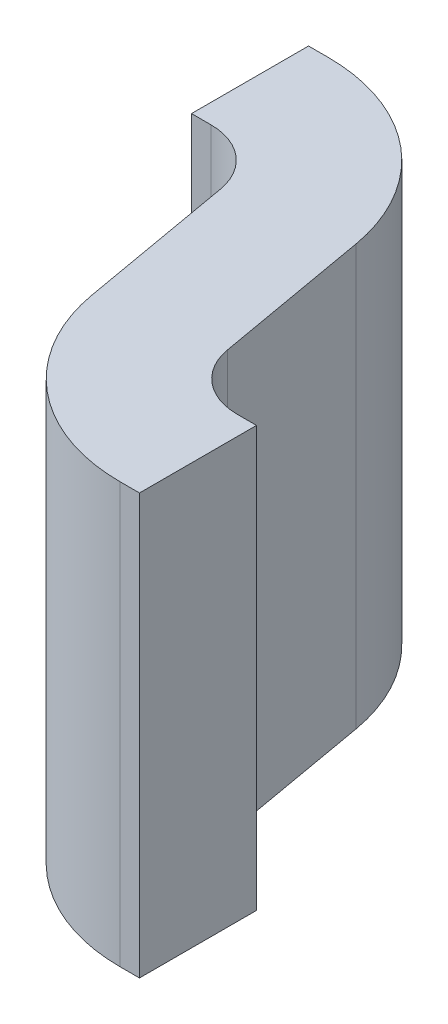
ISO-10303-21;
HEADER;
FILE_DESCRIPTION(('STEP AP214'),'2;1');
FILE_NAME('part.step','',(''),(''),'','','');
FILE_SCHEMA(('AUTOMOTIVE_DESIGN { 1 0 10303 214 1 1 1 1 }'));
ENDSEC;
DATA;
#1=APPLICATION_CONTEXT('core data for automotive mechanical design processes');
#2=APPLICATION_PROTOCOL_DEFINITION('international standard','automotive_design',2000,#1);
#3=PRODUCT_CONTEXT('',#1,'mechanical');
#4=PRODUCT('Part','Part','',(#3));
#5=PRODUCT_RELATED_PRODUCT_CATEGORY('part','',(#4));
#6=PRODUCT_DEFINITION_FORMATION('','',#4);
#7=PRODUCT_DEFINITION_CONTEXT('part definition',#1,'design');
#8=PRODUCT_DEFINITION('design','',#6,#7);
#9=PRODUCT_DEFINITION_SHAPE('','',#8);
#10=(LENGTH_UNIT() NAMED_UNIT(*) SI_UNIT(.MILLI.,.METRE.));
#11=(NAMED_UNIT(*) PLANE_ANGLE_UNIT() SI_UNIT($,.RADIAN.));
#12=(NAMED_UNIT(*) SI_UNIT($,.STERADIAN.) SOLID_ANGLE_UNIT());
#13=UNCERTAINTY_MEASURE_WITH_UNIT(LENGTH_MEASURE(1.E-05),#10,'distance_accuracy_value','');
#14=(GEOMETRIC_REPRESENTATION_CONTEXT(3) GLOBAL_UNCERTAINTY_ASSIGNED_CONTEXT((#13)) GLOBAL_UNIT_ASSIGNED_CONTEXT((#10,
#11,#12)) REPRESENTATION_CONTEXT('',''));
#15=CARTESIAN_POINT('',(0.,0.,0.));
#16=DIRECTION('',(0.,0.,1.));
#17=DIRECTION('',(1.,0.,0.));
#18=AXIS2_PLACEMENT_3D('',#15,#16,#17);
#19=CARTESIAN_POINT('',(0.,-0.35,-0.0975));
#20=DIRECTION('',(0.,0.,-1.));
#21=DIRECTION('',(-1.,0.,0.));
#22=AXIS2_PLACEMENT_3D('',#19,#20,#21);
#23=PLANE('',#22);
#24=DIRECTION('',(0.,1.,0.));
#25=VECTOR('',#24,1.);
#26=CARTESIAN_POINT('',(0.,0.,-0.0975));
#27=LINE('',#26,#25);
#28=CARTESIAN_POINT('',(0.,-0.35,-0.0975));
#29=VERTEX_POINT('',#28);
#30=CARTESIAN_POINT('',(0.,0.35,-0.0975));
#31=VERTEX_POINT('',#30);
#32=EDGE_CURVE('E98',#29,#31,#27,.T.);
#33=ORIENTED_EDGE('',*,*,#32,.F.);
#34=DIRECTION('',(1.,0.,0.));
#35=VECTOR('',#34,1.);
#36=CARTESIAN_POINT('',(0.,-0.35,-0.0975));
#37=LINE('',#36,#35);
#38=CARTESIAN_POINT('',(-0.03218007376454,-0.35,-0.0975));
#39=VERTEX_POINT('',#38);
#40=EDGE_CURVE('E164',#39,#29,#37,.T.);
#41=ORIENTED_EDGE('',*,*,#40,.F.);
#42=DIRECTION('',(0.,-1.,0.));
#43=VECTOR('',#42,1.);
#44=CARTESIAN_POINT('',(-0.03218007376454,0.,-0.0975));
#45=LINE('',#44,#43);
#46=CARTESIAN_POINT('',(-0.03218007376454,0.35,-0.0975));
#47=VERTEX_POINT('',#46);
#48=EDGE_CURVE('E89',#39,#47,#45,.F.);
#49=ORIENTED_EDGE('',*,*,#48,.T.);
#50=DIRECTION('',(1.,0.,0.));
#51=VECTOR('',#50,1.);
#52=CARTESIAN_POINT('',(0.,0.35,-0.0975));
#53=LINE('',#52,#51);
#54=EDGE_CURVE('E178',#31,#47,#53,.F.);
#55=ORIENTED_EDGE('',*,*,#54,.F.);
#56=EDGE_LOOP('',(#33,#41,#49,#55));
#57=FACE_BOUND('',#56,.T.);
#58=ADVANCED_FACE('F17',(#57),#23,.T.);
#59=CARTESIAN_POINT('',(0.,0.,0.));
#60=DIRECTION('',(1.,0.,0.));
#61=DIRECTION('',(0.,0.,-1.));
#62=AXIS2_PLACEMENT_3D('',#59,#60,#61);
#63=PLANE('',#62);
#64=ORIENTED_EDGE('',*,*,#32,.T.);
#65=DIRECTION('',(0.,0.,1.));
#66=VECTOR('',#65,1.);
#67=CARTESIAN_POINT('',(0.,0.35,-0.0975));
#68=LINE('',#67,#66);
#69=CARTESIAN_POINT('',(0.,0.35,0.0975));
#70=VERTEX_POINT('',#69);
#71=EDGE_CURVE('E175',#70,#31,#68,.F.);
#72=ORIENTED_EDGE('',*,*,#71,.F.);
#73=DIRECTION('',(0.,1.,0.));
#74=VECTOR('',#73,1.);
#75=CARTESIAN_POINT('',(0.,0.35,0.0975));
#76=LINE('',#75,#74);
#77=CARTESIAN_POINT('',(0.,-0.35,0.0975));
#78=VERTEX_POINT('',#77);
#79=EDGE_CURVE('E156',#78,#70,#76,.T.);
#80=ORIENTED_EDGE('',*,*,#79,.F.);
#81=DIRECTION('',(0.,0.,-1.));
#82=VECTOR('',#81,1.);
#83=CARTESIAN_POINT('',(0.,-0.35,0.0975));
#84=LINE('',#83,#82);
#85=EDGE_CURVE('E160',#29,#78,#84,.F.);
#86=ORIENTED_EDGE('',*,*,#85,.F.);
#87=EDGE_LOOP('',(#64,#72,#80,#86));
#88=FACE_BOUND('',#87,.T.);
#89=ADVANCED_FACE('F366',(#88),#63,.T.);
#90=CARTESIAN_POINT('',(0.,0.35,0.0975));
#91=DIRECTION('',(0.,0.,1.));
#92=DIRECTION('',(1.,0.,0.));
#93=AXIS2_PLACEMENT_3D('',#90,#91,#92);
#94=PLANE('',#93);
#95=ORIENTED_EDGE('',*,*,#79,.T.);
#96=DIRECTION('',(1.,0.,0.));
#97=VECTOR('',#96,1.);
#98=CARTESIAN_POINT('',(0.,0.35,0.0975));
#99=LINE('',#98,#97);
#100=CARTESIAN_POINT('',(-0.03218007376454,0.35,0.0975));
#101=VERTEX_POINT('',#100);
#102=EDGE_CURVE('E122',#101,#70,#99,.T.);
#103=ORIENTED_EDGE('',*,*,#102,.F.);
#104=DIRECTION('',(0.,-1.,0.));
#105=VECTOR('',#104,1.);
#106=CARTESIAN_POINT('',(-0.03218007376454,0.,0.0975));
#107=LINE('',#106,#105);
#108=CARTESIAN_POINT('',(-0.03218007376454,-0.35,0.0975));
#109=VERTEX_POINT('',#108);
#110=EDGE_CURVE('E153',#109,#101,#107,.F.);
#111=ORIENTED_EDGE('',*,*,#110,.F.);
#112=DIRECTION('',(1.,0.,0.));
#113=VECTOR('',#112,1.);
#114=CARTESIAN_POINT('',(0.,-0.35,0.0975));
#115=LINE('',#114,#113);
#116=EDGE_CURVE('E163',#78,#109,#115,.F.);
#117=ORIENTED_EDGE('',*,*,#116,.F.);
#118=EDGE_LOOP('',(#95,#103,#111,#117));
#119=FACE_BOUND('',#118,.T.);
#120=ADVANCED_FACE('F355',(#119),#94,.T.);
#121=CARTESIAN_POINT('',(-0.03218007376454,0.,-0.2));
#122=DIRECTION('',(0.,-1.,0.));
#123=DIRECTION('',(0.,0.,-1.));
#124=AXIS2_PLACEMENT_3D('',#121,#122,#123);
#125=CYLINDRICAL_SURFACE('',#124,0.2975);
#126=ORIENTED_EDGE('',*,*,#110,.T.);
#127=CARTESIAN_POINT('',(-0.03218007376454,0.35,-0.2));
#128=DIRECTION('',(0.,-1.,0.));
#129=DIRECTION('',(0.,0.,-1.));
#130=AXIS2_PLACEMENT_3D('',#127,#128,#129);
#131=CIRCLE('',#130,0.2975);
#132=CARTESIAN_POINT('',(-0.325160380286019,0.35,-0.148339667144107));
#133=VERTEX_POINT('',#132);
#134=EDGE_CURVE('E192',#133,#101,#131,.F.);
#135=ORIENTED_EDGE('',*,*,#134,.F.);
#136=DIRECTION('',(0.,1.,0.));
#137=VECTOR('',#136,1.);
#138=CARTESIAN_POINT('',(-0.325160380286,0.35,-0.148339667144));
#139=LINE('',#138,#137);
#140=CARTESIAN_POINT('',(-0.325160380286019,-0.35,-0.148339667144107));
#141=VERTEX_POINT('',#140);
#142=EDGE_CURVE('E151',#141,#133,#139,.T.);
#143=ORIENTED_EDGE('',*,*,#142,.F.);
#144=CARTESIAN_POINT('',(-0.03218007376454,-0.35,-0.2));
#145=DIRECTION('',(0.,-1.,0.));
#146=DIRECTION('',(0.,0.,-1.));
#147=AXIS2_PLACEMENT_3D('',#144,#145,#146);
#148=CIRCLE('',#147,0.2975);
#149=EDGE_CURVE('E189',#109,#141,#148,.T.);
#150=ORIENTED_EDGE('',*,*,#149,.F.);
#151=EDGE_LOOP('',(#126,#135,#143,#150));
#152=FACE_BOUND('',#151,.T.);
#153=ADVANCED_FACE('F344',(#152),#125,.T.);
#154=CARTESIAN_POINT('',(-0.325160380286,0.35,-0.148339667144));
#155=DIRECTION('',(-0.98480775301219,0.,0.173648177667033));
#156=DIRECTION('',(0.173648177667033,0.,0.98480775301219));
#157=AXIS2_PLACEMENT_3D('',#154,#155,#156);
#158=PLANE('',#157);
#159=ORIENTED_EDGE('',*,*,#142,.T.);
#160=DIRECTION('',(0.173648177666307,0.,0.984807753012318));
#161=VECTOR('',#160,1.);
#162=CARTESIAN_POINT('',(-0.371066038152,0.35,-0.408683590018));
#163=LINE('',#162,#161);
#164=CARTESIAN_POINT('',(-0.371066038152119,0.35,-0.408683590017898));
#165=VERTEX_POINT('',#164);
#166=EDGE_CURVE('E195',#165,#133,#163,.T.);
#167=ORIENTED_EDGE('',*,*,#166,.F.);
#168=DIRECTION('',(0.,1.,0.));
#169=VECTOR('',#168,1.);
#170=CARTESIAN_POINT('',(-0.371066038152265,0.,-0.408683590017953));
#171=LINE('',#170,#169);
#172=CARTESIAN_POINT('',(-0.371066038152119,-0.35,-0.408683590017898));
#173=VERTEX_POINT('',#172);
#174=EDGE_CURVE('E149',#165,#173,#171,.F.);
#175=ORIENTED_EDGE('',*,*,#174,.T.);
#176=DIRECTION('',(-0.173648177666307,0.,-0.984807753012318));
#177=VECTOR('',#176,1.);
#178=CARTESIAN_POINT('',(-0.325160380286,-0.35,-0.148339667144));
#179=LINE('',#178,#177);
#180=EDGE_CURVE('E188',#141,#173,#179,.T.);
#181=ORIENTED_EDGE('',*,*,#180,.F.);
#182=EDGE_LOOP('',(#159,#167,#175,#181));
#183=FACE_BOUND('',#182,.T.);
#184=ADVANCED_FACE('F333',(#183),#158,.T.);
#185=CARTESIAN_POINT('',(-0.472008832836,0.,-0.390884651807));
#186=DIRECTION('',(0.,1.,0.));
#187=DIRECTION('',(0.,0.,1.));
#188=AXIS2_PLACEMENT_3D('',#185,#186,#187);
#189=CYLINDRICAL_SURFACE('',#188,0.1025);
#190=CARTESIAN_POINT('',(-0.472008832836,-0.35,-0.390884651807));
#191=DIRECTION('',(0.,1.,0.));
#192=DIRECTION('',(0.,0.,1.));
#193=AXIS2_PLACEMENT_3D('',#190,#191,#192);
#194=CIRCLE('',#193,0.1025);
#195=CARTESIAN_POINT('',(-0.472008832836,-0.35,-0.493384651807));
#196=VERTEX_POINT('',#195);
#197=EDGE_CURVE('E136',#173,#196,#194,.T.);
#198=ORIENTED_EDGE('',*,*,#197,.F.);
#199=ORIENTED_EDGE('',*,*,#174,.F.);
#200=CARTESIAN_POINT('',(-0.472008832836,0.35,-0.390884651807));
#201=DIRECTION('',(0.,1.,0.));
#202=DIRECTION('',(0.,0.,1.));
#203=AXIS2_PLACEMENT_3D('',#200,#201,#202);
#204=CIRCLE('',#203,0.1025);
#205=CARTESIAN_POINT('',(-0.472008832836,0.35,-0.493384651807));
#206=VERTEX_POINT('',#205);
#207=EDGE_CURVE('E196',#206,#165,#204,.F.);
#208=ORIENTED_EDGE('',*,*,#207,.F.);
#209=DIRECTION('',(0.,1.,0.));
#210=VECTOR('',#209,1.);
#211=CARTESIAN_POINT('',(-0.472008832836,0.35,-0.493384651807));
#212=LINE('',#211,#210);
#213=EDGE_CURVE('E145',#196,#206,#212,.T.);
#214=ORIENTED_EDGE('',*,*,#213,.F.);
#215=EDGE_LOOP('',(#198,#199,#208,#214));
#216=FACE_BOUND('',#215,.T.);
#217=ADVANCED_FACE('F322',(#216),#189,.F.);
#218=CARTESIAN_POINT('',(-0.472008832836,0.35,-0.493384651807));
#219=DIRECTION('',(0.,0.,1.));
#220=DIRECTION('',(1.,0.,0.));
#221=AXIS2_PLACEMENT_3D('',#218,#219,#220);
#222=PLANE('',#221);
#223=ORIENTED_EDGE('',*,*,#213,.T.);
#224=DIRECTION('',(1.,0.,0.));
#225=VECTOR('',#224,1.);
#226=CARTESIAN_POINT('',(0.,0.35,-0.493384651807));
#227=LINE('',#226,#225);
#228=CARTESIAN_POINT('',(-0.5041889066,0.35,-0.493384651807));
#229=VERTEX_POINT('',#228);
#230=EDGE_CURVE('E171',#229,#206,#227,.T.);
#231=ORIENTED_EDGE('',*,*,#230,.F.);
#232=DIRECTION('',(0.,1.,0.));
#233=VECTOR('',#232,1.);
#234=CARTESIAN_POINT('',(-0.5041889066,0.,-0.493384651807));
#235=LINE('',#234,#233);
#236=CARTESIAN_POINT('',(-0.5041889066,-0.35,-0.493384651807));
#237=VERTEX_POINT('',#236);
#238=EDGE_CURVE('E143',#229,#237,#235,.F.);
#239=ORIENTED_EDGE('',*,*,#238,.T.);
#240=DIRECTION('',(1.,0.,0.));
#241=VECTOR('',#240,1.);
#242=CARTESIAN_POINT('',(0.,-0.35,-0.493384651807));
#243=LINE('',#242,#241);
#244=EDGE_CURVE('E134',#196,#237,#243,.F.);
#245=ORIENTED_EDGE('',*,*,#244,.F.);
#246=EDGE_LOOP('',(#223,#231,#239,#245));
#247=FACE_BOUND('',#246,.T.);
#248=ADVANCED_FACE('F312',(#247),#222,.T.);
#249=CARTESIAN_POINT('',(-0.5041889066,0.,-0.590884651807));
#250=DIRECTION('',(1.,0.,0.));
#251=DIRECTION('',(0.,0.,-1.));
#252=AXIS2_PLACEMENT_3D('',#249,#250,#251);
#253=PLANE('',#252);
#254=ORIENTED_EDGE('',*,*,#238,.F.);
#255=DIRECTION('',(0.,0.,1.));
#256=VECTOR('',#255,1.);
#257=CARTESIAN_POINT('',(-0.5041889066,0.35,-0.0975));
#258=LINE('',#257,#256);
#259=CARTESIAN_POINT('',(-0.5041889066,0.35,-0.688384651807));
#260=VERTEX_POINT('',#259);
#261=EDGE_CURVE('E119',#260,#229,#258,.T.);
#262=ORIENTED_EDGE('',*,*,#261,.F.);
#263=DIRECTION('',(0.,1.,0.));
#264=VECTOR('',#263,1.);
#265=CARTESIAN_POINT('',(-0.5041889066,-0.35,-0.688384651807));
#266=LINE('',#265,#264);
#267=CARTESIAN_POINT('',(-0.5041889066,-0.35,-0.688384651807));
#268=VERTEX_POINT('',#267);
#269=EDGE_CURVE('E112',#268,#260,#266,.T.);
#270=ORIENTED_EDGE('',*,*,#269,.F.);
#271=DIRECTION('',(0.,0.,-1.));
#272=VECTOR('',#271,1.);
#273=CARTESIAN_POINT('',(-0.5041889066,-0.35,0.0975));
#274=LINE('',#273,#272);
#275=EDGE_CURVE('E116',#237,#268,#274,.T.);
#276=ORIENTED_EDGE('',*,*,#275,.F.);
#277=EDGE_LOOP('',(#254,#262,#270,#276));
#278=FACE_BOUND('',#277,.T.);
#279=ADVANCED_FACE('F114',(#278),#253,.F.);
#280=CARTESIAN_POINT('',(-0.03218007376454,0.,-0.2));
#281=DIRECTION('',(0.,-1.,0.));
#282=DIRECTION('',(0.,0.,-1.));
#283=AXIS2_PLACEMENT_3D('',#280,#281,#282);
#284=CYLINDRICAL_SURFACE('',#283,0.1025);
#285=CARTESIAN_POINT('',(-0.03218007376454,0.35,-0.2));
#286=DIRECTION('',(0.,-1.,0.));
#287=DIRECTION('',(0.,0.,-1.));
#288=AXIS2_PLACEMENT_3D('',#285,#286,#287);
#289=CIRCLE('',#288,0.1025);
#290=CARTESIAN_POINT('',(-0.133122868448015,0.35,-0.182201061789087));
#291=VERTEX_POINT('',#290);
#292=EDGE_CURVE('E20',#47,#291,#289,.T.);
#293=ORIENTED_EDGE('',*,*,#292,.F.);
#294=ORIENTED_EDGE('',*,*,#48,.F.);
#295=CARTESIAN_POINT('',(-0.03218007376454,-0.35,-0.2));
#296=DIRECTION('',(0.,-1.,0.));
#297=DIRECTION('',(0.,0.,-1.));
#298=AXIS2_PLACEMENT_3D('',#295,#296,#297);
#299=CIRCLE('',#298,0.1025);
#300=CARTESIAN_POINT('',(-0.133122868448022,-0.35,-0.182201061789125));
#301=VERTEX_POINT('',#300);
#302=EDGE_CURVE('E184',#301,#39,#299,.F.);
#303=ORIENTED_EDGE('',*,*,#302,.F.);
#304=DIRECTION('',(0.,1.,0.));
#305=VECTOR('',#304,1.);
#306=CARTESIAN_POINT('',(-0.133122868448,-0.35,-0.182201061789));
#307=LINE('',#306,#305);
#308=EDGE_CURVE('E221',#291,#301,#307,.F.);
#309=ORIENTED_EDGE('',*,*,#308,.F.);
#310=EDGE_LOOP('',(#293,#294,#303,#309));
#311=FACE_BOUND('',#310,.T.);
#312=ADVANCED_FACE('F292',(#311),#284,.F.);
#313=CARTESIAN_POINT('',(-0.472008832836,-0.35,-0.688384651807));
#314=DIRECTION('',(0.,0.,-1.));
#315=DIRECTION('',(-1.,0.,0.));
#316=AXIS2_PLACEMENT_3D('',#313,#314,#315);
#317=PLANE('',#316);
#318=DIRECTION('',(0.,1.,0.));
#319=VECTOR('',#318,1.);
#320=CARTESIAN_POINT('',(-0.472008832836,0.,-0.688384651807));
#321=LINE('',#320,#319);
#322=CARTESIAN_POINT('',(-0.472008832836,-0.35,-0.688384651807));
#323=VERTEX_POINT('',#322);
#324=CARTESIAN_POINT('',(-0.472008832836,0.35,-0.688384651807));
#325=VERTEX_POINT('',#324);
#326=EDGE_CURVE('E128',#323,#325,#321,.T.);
#327=ORIENTED_EDGE('',*,*,#326,.F.);
#328=DIRECTION('',(1.,0.,0.));
#329=VECTOR('',#328,1.);
#330=CARTESIAN_POINT('',(0.,-0.35,-0.688384651807));
#331=LINE('',#330,#329);
#332=EDGE_CURVE('E125',#268,#323,#331,.T.);
#333=ORIENTED_EDGE('',*,*,#332,.F.);
#334=ORIENTED_EDGE('',*,*,#269,.T.);
#335=DIRECTION('',(1.,0.,0.));
#336=VECTOR('',#335,1.);
#337=CARTESIAN_POINT('',(0.,0.35,-0.688384651807));
#338=LINE('',#337,#336);
#339=EDGE_CURVE('E172',#325,#260,#338,.F.);
#340=ORIENTED_EDGE('',*,*,#339,.F.);
#341=EDGE_LOOP('',(#327,#333,#334,#340));
#342=FACE_BOUND('',#341,.T.);
#343=ADVANCED_FACE('F126',(#342),#317,.T.);
#344=CARTESIAN_POINT('',(0.,0.35,-0.0975));
#345=DIRECTION('',(0.,1.,0.));
#346=DIRECTION('',(0.,0.,1.));
#347=AXIS2_PLACEMENT_3D('',#344,#345,#346);
#348=PLANE('',#347);
#349=ORIENTED_EDGE('',*,*,#166,.T.);
#350=ORIENTED_EDGE('',*,*,#134,.T.);
#351=ORIENTED_EDGE('',*,*,#102,.T.);
#352=ORIENTED_EDGE('',*,*,#71,.T.);
#353=ORIENTED_EDGE('',*,*,#54,.T.);
#354=ORIENTED_EDGE('',*,*,#292,.T.);
#355=DIRECTION('',(-0.173648177667033,0.,-0.98480775301219));
#356=VECTOR('',#355,1.);
#357=CARTESIAN_POINT('',(-0.133122868448,0.35,-0.182201061789));
#358=LINE('',#357,#356);
#359=CARTESIAN_POINT('',(-0.179028526314533,0.35,-0.442544984662954));
#360=VERTEX_POINT('',#359);
#361=EDGE_CURVE('E194',#360,#291,#358,.F.);
#362=ORIENTED_EDGE('',*,*,#361,.F.);
#363=CARTESIAN_POINT('',(-0.472008832836,0.35,-0.390884651807));
#364=DIRECTION('',(0.,1.,0.));
#365=DIRECTION('',(0.,0.,1.));
#366=AXIS2_PLACEMENT_3D('',#363,#364,#365);
#367=CIRCLE('',#366,0.2975);
#368=EDGE_CURVE('E181',#325,#360,#367,.F.);
#369=ORIENTED_EDGE('',*,*,#368,.F.);
#370=ORIENTED_EDGE('',*,*,#339,.T.);
#371=ORIENTED_EDGE('',*,*,#261,.T.);
#372=ORIENTED_EDGE('',*,*,#230,.T.);
#373=ORIENTED_EDGE('',*,*,#207,.T.);
#374=EDGE_LOOP('',(#349,#350,#351,#352,#353,#354,#362,#369,#370,#371,#372,#373));
#375=FACE_BOUND('',#374,.T.);
#376=ADVANCED_FACE('F248',(#375),#348,.T.);
#377=CARTESIAN_POINT('',(-0.133122868448,-0.35,-0.182201061789));
#378=DIRECTION('',(0.98480775301219,0.,-0.173648177667033));
#379=DIRECTION('',(-0.173648177667033,0.,-0.98480775301219));
#380=AXIS2_PLACEMENT_3D('',#377,#378,#379);
#381=PLANE('',#380);
#382=ORIENTED_EDGE('',*,*,#308,.T.);
#383=DIRECTION('',(0.173648177666307,0.,0.984807753012318));
#384=VECTOR('',#383,1.);
#385=CARTESIAN_POINT('',(-0.179028526314,-0.35,-0.442544984663));
#386=LINE('',#385,#384);
#387=CARTESIAN_POINT('',(-0.179028526314418,-0.35,-0.442544984662863));
#388=VERTEX_POINT('',#387);
#389=EDGE_CURVE('E35',#388,#301,#386,.T.);
#390=ORIENTED_EDGE('',*,*,#389,.F.);
#391=DIRECTION('',(0.,1.,0.));
#392=VECTOR('',#391,1.);
#393=CARTESIAN_POINT('',(-0.179028526314857,0.,-0.442544984662849));
#394=LINE('',#393,#392);
#395=EDGE_CURVE('E26',#360,#388,#394,.F.);
#396=ORIENTED_EDGE('',*,*,#395,.F.);
#397=ORIENTED_EDGE('',*,*,#361,.T.);
#398=EDGE_LOOP('',(#382,#390,#396,#397));
#399=FACE_BOUND('',#398,.T.);
#400=ADVANCED_FACE('F246',(#399),#381,.T.);
#401=CARTESIAN_POINT('',(0.,-0.35,0.0975));
#402=DIRECTION('',(0.,-1.,0.));
#403=DIRECTION('',(0.,0.,-1.));
#404=AXIS2_PLACEMENT_3D('',#401,#402,#403);
#405=PLANE('',#404);
#406=ORIENTED_EDGE('',*,*,#389,.T.);
#407=ORIENTED_EDGE('',*,*,#302,.T.);
#408=ORIENTED_EDGE('',*,*,#40,.T.);
#409=ORIENTED_EDGE('',*,*,#85,.T.);
#410=ORIENTED_EDGE('',*,*,#116,.T.);
#411=ORIENTED_EDGE('',*,*,#149,.T.);
#412=ORIENTED_EDGE('',*,*,#180,.T.);
#413=ORIENTED_EDGE('',*,*,#197,.T.);
#414=ORIENTED_EDGE('',*,*,#244,.T.);
#415=ORIENTED_EDGE('',*,*,#275,.T.);
#416=ORIENTED_EDGE('',*,*,#332,.T.);
#417=CARTESIAN_POINT('',(-0.472008832836,-0.35,-0.390884651807));
#418=DIRECTION('',(0.,1.,0.));
#419=DIRECTION('',(0.,0.,1.));
#420=AXIS2_PLACEMENT_3D('',#417,#418,#419);
#421=CIRCLE('',#420,0.2975);
#422=EDGE_CURVE('E11',#388,#323,#421,.T.);
#423=ORIENTED_EDGE('',*,*,#422,.F.);
#424=EDGE_LOOP('',(#406,#407,#408,#409,#410,#411,#412,#413,#414,#415,#416,#423));
#425=FACE_BOUND('',#424,.T.);
#426=ADVANCED_FACE('F131',(#425),#405,.T.);
#427=CARTESIAN_POINT('',(-0.472008832836,0.,-0.390884651807));
#428=DIRECTION('',(0.,1.,0.));
#429=DIRECTION('',(0.,0.,1.));
#430=AXIS2_PLACEMENT_3D('',#427,#428,#429);
#431=CYLINDRICAL_SURFACE('',#430,0.2975);
#432=ORIENTED_EDGE('',*,*,#395,.T.);
#433=ORIENTED_EDGE('',*,*,#422,.T.);
#434=ORIENTED_EDGE('',*,*,#326,.T.);
#435=ORIENTED_EDGE('',*,*,#368,.T.);
#436=EDGE_LOOP('',(#432,#433,#434,#435));
#437=FACE_BOUND('',#436,.T.);
#438=ADVANCED_FACE('F244',(#437),#431,.T.);
#439=CLOSED_SHELL('',(#58,#89,#120,#153,#184,#217,#248,#279,#312,#343,#376,#400,#426,#438));
#440=MANIFOLD_SOLID_BREP('B1',#439);
#441=ADVANCED_BREP_SHAPE_REPRESENTATION('',(#18,#440),#14);
#442=SHAPE_DEFINITION_REPRESENTATION(#9,#441);
ENDSEC;
END-ISO-10303-21;
